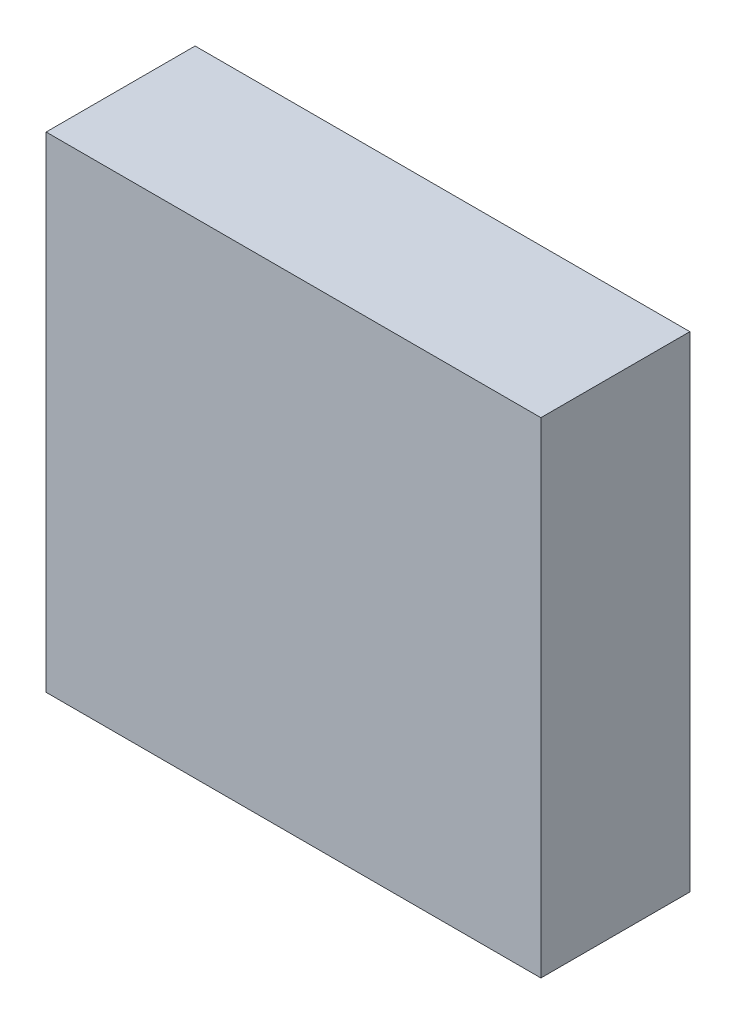
ISO-10303-21;
HEADER;
FILE_DESCRIPTION(('STEP AP214'),'2;1');
FILE_NAME('part.step','',(''),(''),'','','');
FILE_SCHEMA(('AUTOMOTIVE_DESIGN { 1 0 10303 214 1 1 1 1 }'));
ENDSEC;
DATA;
#1=APPLICATION_CONTEXT('core data for automotive mechanical design processes');
#2=APPLICATION_PROTOCOL_DEFINITION('international standard','automotive_design',2000,#1);
#3=PRODUCT_CONTEXT('',#1,'mechanical');
#4=PRODUCT('Part','Part','',(#3));
#5=PRODUCT_RELATED_PRODUCT_CATEGORY('part','',(#4));
#6=PRODUCT_DEFINITION_FORMATION('','',#4);
#7=PRODUCT_DEFINITION_CONTEXT('part definition',#1,'design');
#8=PRODUCT_DEFINITION('design','',#6,#7);
#9=PRODUCT_DEFINITION_SHAPE('','',#8);
#10=(LENGTH_UNIT() NAMED_UNIT(*) SI_UNIT(.MILLI.,.METRE.));
#11=(NAMED_UNIT(*) PLANE_ANGLE_UNIT() SI_UNIT($,.RADIAN.));
#12=(NAMED_UNIT(*) SI_UNIT($,.STERADIAN.) SOLID_ANGLE_UNIT());
#13=UNCERTAINTY_MEASURE_WITH_UNIT(LENGTH_MEASURE(1.E-05),#10,'distance_accuracy_value','');
#14=(GEOMETRIC_REPRESENTATION_CONTEXT(3) GLOBAL_UNCERTAINTY_ASSIGNED_CONTEXT((#13)) GLOBAL_UNIT_ASSIGNED_CONTEXT((#10,
#11,#12)) REPRESENTATION_CONTEXT('',''));
#15=CARTESIAN_POINT('',(0.,0.,0.));
#16=DIRECTION('',(0.,0.,1.));
#17=DIRECTION('',(1.,0.,0.));
#18=AXIS2_PLACEMENT_3D('',#15,#16,#17);
#19=CARTESIAN_POINT('',(-1.7577,-1.5,1.));
#20=DIRECTION('',(1.,0.,0.));
#21=DIRECTION('',(0.,0.,-1.));
#22=AXIS2_PLACEMENT_3D('',#19,#20,#21);
#23=PLANE('',#22);
#24=DIRECTION('',(0.,-1.,0.));
#25=VECTOR('',#24,1.);
#26=CARTESIAN_POINT('',(-1.7577,-1.5,0.));
#27=LINE('',#26,#25);
#28=CARTESIAN_POINT('',(-1.7577,1.7575,0.));
#29=VERTEX_POINT('',#28);
#30=CARTESIAN_POINT('',(-1.7577,-1.5,0.));
#31=VERTEX_POINT('',#30);
#32=EDGE_CURVE('E96',#29,#31,#27,.T.);
#33=ORIENTED_EDGE('',*,*,#32,.T.);
#34=DIRECTION('',(0.,0.,-1.));
#35=VECTOR('',#34,1.);
#36=CARTESIAN_POINT('',(-1.7577,-1.5,1.));
#37=LINE('',#36,#35);
#38=CARTESIAN_POINT('',(-1.7577,-1.5,1.));
#39=VERTEX_POINT('',#38);
#40=EDGE_CURVE('E11',#39,#31,#37,.T.);
#41=ORIENTED_EDGE('',*,*,#40,.F.);
#42=DIRECTION('',(0.,-1.,0.));
#43=VECTOR('',#42,1.);
#44=CARTESIAN_POINT('',(-1.7577,-1.5,1.));
#45=LINE('',#44,#43);
#46=CARTESIAN_POINT('',(-1.7577,1.7575,1.));
#47=VERTEX_POINT('',#46);
#48=EDGE_CURVE('E84',#47,#39,#45,.T.);
#49=ORIENTED_EDGE('',*,*,#48,.F.);
#50=DIRECTION('',(0.,0.,-1.));
#51=VECTOR('',#50,1.);
#52=CARTESIAN_POINT('',(-1.7577,1.7575,1.));
#53=LINE('',#52,#51);
#54=EDGE_CURVE('E92',#47,#29,#53,.T.);
#55=ORIENTED_EDGE('',*,*,#54,.T.);
#56=EDGE_LOOP('',(#33,#41,#49,#55));
#57=FACE_BOUND('',#56,.T.);
#58=ADVANCED_FACE('F33',(#57),#23,.F.);
#59=CARTESIAN_POINT('',(1.5635,-1.5,1.));
#60=DIRECTION('',(0.,1.,0.));
#61=DIRECTION('',(0.,0.,1.));
#62=AXIS2_PLACEMENT_3D('',#59,#60,#61);
#63=PLANE('',#62);
#64=DIRECTION('',(1.,0.,0.));
#65=VECTOR('',#64,1.);
#66=CARTESIAN_POINT('',(1.5635,-1.5,0.));
#67=LINE('',#66,#65);
#68=CARTESIAN_POINT('',(1.5635,-1.5,0.));
#69=VERTEX_POINT('',#68);
#70=EDGE_CURVE('E88',#31,#69,#67,.T.);
#71=ORIENTED_EDGE('',*,*,#70,.T.);
#72=DIRECTION('',(0.,0.,-1.));
#73=VECTOR('',#72,1.);
#74=CARTESIAN_POINT('',(1.5635,-1.5,1.));
#75=LINE('',#74,#73);
#76=CARTESIAN_POINT('',(1.5635,-1.5,1.));
#77=VERTEX_POINT('',#76);
#78=EDGE_CURVE('E41',#77,#69,#75,.T.);
#79=ORIENTED_EDGE('',*,*,#78,.F.);
#80=DIRECTION('',(1.,0.,0.));
#81=VECTOR('',#80,1.);
#82=CARTESIAN_POINT('',(1.5635,-1.5,1.));
#83=LINE('',#82,#81);
#84=EDGE_CURVE('E79',#39,#77,#83,.T.);
#85=ORIENTED_EDGE('',*,*,#84,.F.);
#86=ORIENTED_EDGE('',*,*,#40,.T.);
#87=EDGE_LOOP('',(#71,#79,#85,#86));
#88=FACE_BOUND('',#87,.T.);
#89=ADVANCED_FACE('F87',(#88),#63,.F.);
#90=CARTESIAN_POINT('',(1.5635,1.7575,1.));
#91=DIRECTION('',(-1.,0.,0.));
#92=DIRECTION('',(0.,0.,1.));
#93=AXIS2_PLACEMENT_3D('',#90,#91,#92);
#94=PLANE('',#93);
#95=DIRECTION('',(0.,1.,0.));
#96=VECTOR('',#95,1.);
#97=CARTESIAN_POINT('',(1.5635,1.7575,0.));
#98=LINE('',#97,#96);
#99=CARTESIAN_POINT('',(1.5635,1.7575,0.));
#100=VERTEX_POINT('',#99);
#101=EDGE_CURVE('E66',#69,#100,#98,.T.);
#102=ORIENTED_EDGE('',*,*,#101,.T.);
#103=DIRECTION('',(0.,0.,-1.));
#104=VECTOR('',#103,1.);
#105=CARTESIAN_POINT('',(1.5635,1.7575,1.));
#106=LINE('',#105,#104);
#107=CARTESIAN_POINT('',(1.5635,1.7575,1.));
#108=VERTEX_POINT('',#107);
#109=EDGE_CURVE('E89',#108,#100,#106,.T.);
#110=ORIENTED_EDGE('',*,*,#109,.F.);
#111=DIRECTION('',(0.,1.,0.));
#112=VECTOR('',#111,1.);
#113=CARTESIAN_POINT('',(1.5635,1.7575,1.));
#114=LINE('',#113,#112);
#115=EDGE_CURVE('E82',#77,#108,#114,.T.);
#116=ORIENTED_EDGE('',*,*,#115,.F.);
#117=ORIENTED_EDGE('',*,*,#78,.T.);
#118=EDGE_LOOP('',(#102,#110,#116,#117));
#119=FACE_BOUND('',#118,.T.);
#120=ADVANCED_FACE('F90',(#119),#94,.F.);
#121=CARTESIAN_POINT('',(-1.7577,1.7575,1.));
#122=DIRECTION('',(0.,-1.,0.));
#123=DIRECTION('',(0.,0.,-1.));
#124=AXIS2_PLACEMENT_3D('',#121,#122,#123);
#125=PLANE('',#124);
#126=DIRECTION('',(-1.,0.,0.));
#127=VECTOR('',#126,1.);
#128=CARTESIAN_POINT('',(-1.7577,1.7575,0.));
#129=LINE('',#128,#127);
#130=EDGE_CURVE('E72',#100,#29,#129,.T.);
#131=ORIENTED_EDGE('',*,*,#130,.T.);
#132=ORIENTED_EDGE('',*,*,#54,.F.);
#133=DIRECTION('',(-1.,0.,0.));
#134=VECTOR('',#133,1.);
#135=CARTESIAN_POINT('',(-1.7577,1.7575,1.));
#136=LINE('',#135,#134);
#137=EDGE_CURVE('E49',#108,#47,#136,.T.);
#138=ORIENTED_EDGE('',*,*,#137,.F.);
#139=ORIENTED_EDGE('',*,*,#109,.T.);
#140=EDGE_LOOP('',(#131,#132,#138,#139));
#141=FACE_BOUND('',#140,.T.);
#142=ADVANCED_FACE('F103',(#141),#125,.F.);
#143=CARTESIAN_POINT('',(0.,0.,1.));
#144=DIRECTION('',(0.,0.,-1.));
#145=DIRECTION('',(-1.,0.,0.));
#146=AXIS2_PLACEMENT_3D('',#143,#144,#145);
#147=PLANE('',#146);
#148=ORIENTED_EDGE('',*,*,#48,.T.);
#149=ORIENTED_EDGE('',*,*,#84,.T.);
#150=ORIENTED_EDGE('',*,*,#115,.T.);
#151=ORIENTED_EDGE('',*,*,#137,.T.);
#152=EDGE_LOOP('',(#148,#149,#150,#151));
#153=FACE_BOUND('',#152,.T.);
#154=ADVANCED_FACE('F80',(#153),#147,.F.);
#155=CARTESIAN_POINT('',(0.,0.,0.));
#156=DIRECTION('',(0.,0.,-1.));
#157=DIRECTION('',(-1.,0.,0.));
#158=AXIS2_PLACEMENT_3D('',#155,#156,#157);
#159=PLANE('',#158);
#160=ORIENTED_EDGE('',*,*,#32,.F.);
#161=ORIENTED_EDGE('',*,*,#130,.F.);
#162=ORIENTED_EDGE('',*,*,#101,.F.);
#163=ORIENTED_EDGE('',*,*,#70,.F.);
#164=EDGE_LOOP('',(#160,#161,#162,#163));
#165=FACE_BOUND('',#164,.T.);
#166=ADVANCED_FACE('F106',(#165),#159,.T.);
#167=CLOSED_SHELL('',(#58,#89,#120,#142,#154,#166));
#168=MANIFOLD_SOLID_BREP('B2',#167);
#169=ADVANCED_BREP_SHAPE_REPRESENTATION('',(#18,#168),#14);
#170=SHAPE_DEFINITION_REPRESENTATION(#9,#169);
ENDSEC;
END-ISO-10303-21;
